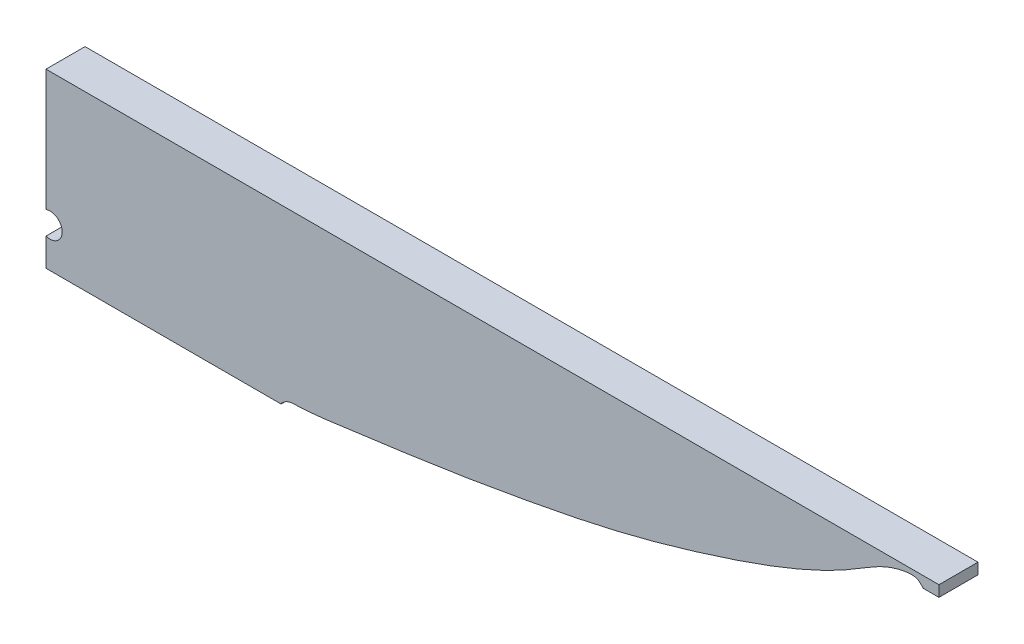
ISO-10303-21;
HEADER;
FILE_DESCRIPTION(('STEP AP214'),'2;1');
FILE_NAME('part.step','',(''),(''),'','','');
FILE_SCHEMA(('AUTOMOTIVE_DESIGN { 1 0 10303 214 1 1 1 1 }'));
ENDSEC;
DATA;
#1=APPLICATION_CONTEXT('core data for automotive mechanical design processes');
#2=APPLICATION_PROTOCOL_DEFINITION('international standard','automotive_design',2000,#1);
#3=PRODUCT_CONTEXT('',#1,'mechanical');
#4=PRODUCT('Part','Part','',(#3));
#5=PRODUCT_RELATED_PRODUCT_CATEGORY('part','',(#4));
#6=PRODUCT_DEFINITION_FORMATION('','',#4);
#7=PRODUCT_DEFINITION_CONTEXT('part definition',#1,'design');
#8=PRODUCT_DEFINITION('design','',#6,#7);
#9=PRODUCT_DEFINITION_SHAPE('','',#8);
#10=(LENGTH_UNIT() NAMED_UNIT(*) SI_UNIT(.MILLI.,.METRE.));
#11=(NAMED_UNIT(*) PLANE_ANGLE_UNIT() SI_UNIT($,.RADIAN.));
#12=(NAMED_UNIT(*) SI_UNIT($,.STERADIAN.) SOLID_ANGLE_UNIT());
#13=UNCERTAINTY_MEASURE_WITH_UNIT(LENGTH_MEASURE(1.E-05),#10,'distance_accuracy_value','');
#14=(GEOMETRIC_REPRESENTATION_CONTEXT(3) GLOBAL_UNCERTAINTY_ASSIGNED_CONTEXT((#13)) GLOBAL_UNIT_ASSIGNED_CONTEXT((#10,
#11,#12)) REPRESENTATION_CONTEXT('',''));
#15=CARTESIAN_POINT('',(0.,0.,0.));
#16=DIRECTION('',(0.,0.,1.));
#17=DIRECTION('',(1.,0.,0.));
#18=AXIS2_PLACEMENT_3D('',#15,#16,#17);
#19=CARTESIAN_POINT('',(-100.827016424963,-33.081913003255,332.));
#20=DIRECTION('',(1.,0.,0.));
#21=DIRECTION('',(0.,0.,-1.));
#22=AXIS2_PLACEMENT_3D('',#19,#20,#21);
#23=PLANE('',#22);
#24=DIRECTION('',(0.,-1.,0.));
#25=VECTOR('',#24,1.);
#26=CARTESIAN_POINT('',(-100.827016424963,-33.081913003255,324.));
#27=LINE('',#26,#25);
#28=CARTESIAN_POINT('',(-100.827016424963,2.25600000000002,324.));
#29=VERTEX_POINT('',#28);
#30=CARTESIAN_POINT('',(-100.827016424963,-22.6407535455487,324.));
#31=VERTEX_POINT('',#30);
#32=EDGE_CURVE('E188',#29,#31,#27,.T.);
#33=ORIENTED_EDGE('',*,*,#32,.T.);
#34=DIRECTION('',(0.,0.,1.));
#35=VECTOR('',#34,1.);
#36=CARTESIAN_POINT('',(-100.827016424963,-22.6407535455487,308.));
#37=LINE('',#36,#35);
#38=CARTESIAN_POINT('',(-100.827016424963,-22.6407535455487,332.));
#39=VERTEX_POINT('',#38);
#40=EDGE_CURVE('E46',#31,#39,#37,.T.);
#41=ORIENTED_EDGE('',*,*,#40,.T.);
#42=DIRECTION('',(0.,-1.,0.));
#43=VECTOR('',#42,1.);
#44=CARTESIAN_POINT('',(-100.827016424963,-33.081913003255,332.));
#45=LINE('',#44,#43);
#46=CARTESIAN_POINT('',(-100.827016424963,2.25600000000002,332.));
#47=VERTEX_POINT('',#46);
#48=EDGE_CURVE('E115',#47,#39,#45,.T.);
#49=ORIENTED_EDGE('',*,*,#48,.F.);
#50=DIRECTION('',(0.,0.,-1.));
#51=VECTOR('',#50,1.);
#52=CARTESIAN_POINT('',(-100.827016424963,2.25600000000002,332.));
#53=LINE('',#52,#51);
#54=EDGE_CURVE('E176',#47,#29,#53,.T.);
#55=ORIENTED_EDGE('',*,*,#54,.T.);
#56=EDGE_LOOP('',(#33,#41,#49,#55));
#57=FACE_BOUND('',#56,.T.);
#58=ADVANCED_FACE('F30',(#57),#23,.F.);
#59=CARTESIAN_POINT('',(82.1113920303362,2.25600000000005,332.));
#60=DIRECTION('',(-1.,0.,0.));
#61=DIRECTION('',(0.,0.,1.));
#62=AXIS2_PLACEMENT_3D('',#59,#60,#61);
#63=PLANE('',#62);
#64=DIRECTION('',(0.,1.,0.));
#65=VECTOR('',#64,1.);
#66=CARTESIAN_POINT('',(82.1113920303362,2.25600000000005,324.));
#67=LINE('',#66,#65);
#68=CARTESIAN_POINT('',(82.1113920303362,0.,324.));
#69=VERTEX_POINT('',#68);
#70=CARTESIAN_POINT('',(82.1113920303362,2.25600000000005,324.));
#71=VERTEX_POINT('',#70);
#72=EDGE_CURVE('E164',#69,#71,#67,.T.);
#73=ORIENTED_EDGE('',*,*,#72,.T.);
#74=DIRECTION('',(0.,0.,-1.));
#75=VECTOR('',#74,1.);
#76=CARTESIAN_POINT('',(82.1113920303362,2.25600000000005,332.));
#77=LINE('',#76,#75);
#78=CARTESIAN_POINT('',(82.1113920303362,2.25600000000005,332.));
#79=VERTEX_POINT('',#78);
#80=EDGE_CURVE('E40',#79,#71,#77,.T.);
#81=ORIENTED_EDGE('',*,*,#80,.F.);
#82=DIRECTION('',(0.,1.,0.));
#83=VECTOR('',#82,1.);
#84=CARTESIAN_POINT('',(82.1113920303362,2.25600000000005,332.));
#85=LINE('',#84,#83);
#86=CARTESIAN_POINT('',(82.1113920303362,0.,332.));
#87=VERTEX_POINT('',#86);
#88=EDGE_CURVE('E224',#87,#79,#85,.T.);
#89=ORIENTED_EDGE('',*,*,#88,.F.);
#90=DIRECTION('',(0.,0.,-1.));
#91=VECTOR('',#90,1.);
#92=CARTESIAN_POINT('',(82.1113920303362,0.,332.));
#93=LINE('',#92,#91);
#94=EDGE_CURVE('E174',#87,#69,#93,.T.);
#95=ORIENTED_EDGE('',*,*,#94,.T.);
#96=EDGE_LOOP('',(#73,#81,#89,#95));
#97=FACE_BOUND('',#96,.T.);
#98=ADVANCED_FACE('F32',(#97),#63,.F.);
#99=CARTESIAN_POINT('',(82.1113920303362,2.25600000000005,332.));
#100=DIRECTION('',(0.,-1.,0.));
#101=DIRECTION('',(1.,0.,0.));
#102=AXIS2_PLACEMENT_3D('',#99,#100,#101);
#103=PLANE('',#102);
#104=DIRECTION('',(-1.,0.,0.));
#105=VECTOR('',#104,1.);
#106=CARTESIAN_POINT('',(82.1113920303362,2.25600000000005,324.));
#107=LINE('',#106,#105);
#108=EDGE_CURVE('E170',#71,#29,#107,.T.);
#109=ORIENTED_EDGE('',*,*,#108,.T.);
#110=ORIENTED_EDGE('',*,*,#54,.F.);
#111=DIRECTION('',(-1.,0.,0.));
#112=VECTOR('',#111,1.);
#113=CARTESIAN_POINT('',(82.1113920303362,2.25600000000005,332.));
#114=LINE('',#113,#112);
#115=EDGE_CURVE('E91',#79,#47,#114,.T.);
#116=ORIENTED_EDGE('',*,*,#115,.F.);
#117=ORIENTED_EDGE('',*,*,#80,.T.);
#118=EDGE_LOOP('',(#109,#110,#116,#117));
#119=FACE_BOUND('',#118,.T.);
#120=ADVANCED_FACE('F180',(#119),#103,.F.);
#121=CARTESIAN_POINT('',(-100.827016424963,-27.3592464544513,332.));
#122=VERTEX_POINT('',#121);
#123=CARTESIAN_POINT('',(-100.827016424963,-33.081913003255,332.));
#124=VERTEX_POINT('',#123);
#125=EDGE_CURVE('E34',#122,#124,#45,.T.);
#126=ORIENTED_EDGE('',*,*,#125,.F.);
#127=DIRECTION('',(0.,0.,1.));
#128=VECTOR('',#127,1.);
#129=CARTESIAN_POINT('',(-100.827016424963,-27.3592464544513,308.));
#130=LINE('',#129,#128);
#131=CARTESIAN_POINT('',(-100.827016424963,-27.3592464544513,324.));
#132=VERTEX_POINT('',#131);
#133=EDGE_CURVE('E259',#122,#132,#130,.F.);
#134=ORIENTED_EDGE('',*,*,#133,.T.);
#135=CARTESIAN_POINT('',(-100.827016424963,-33.081913003255,324.));
#136=VERTEX_POINT('',#135);
#137=EDGE_CURVE('E173',#132,#136,#27,.T.);
#138=ORIENTED_EDGE('',*,*,#137,.T.);
#139=DIRECTION('',(0.,0.,-1.));
#140=VECTOR('',#139,1.);
#141=CARTESIAN_POINT('',(-100.827016424963,-33.081913003255,332.));
#142=LINE('',#141,#140);
#143=EDGE_CURVE('E126',#124,#136,#142,.T.);
#144=ORIENTED_EDGE('',*,*,#143,.F.);
#145=EDGE_LOOP('',(#126,#134,#138,#144));
#146=FACE_BOUND('',#145,.T.);
#147=ADVANCED_FACE('F257',(#146),#23,.F.);
#148=CARTESIAN_POINT('',(-100.827016424963,-33.081913003255,332.));
#149=CARTESIAN_POINT('',(-84.774613711413,-33.0815951122996,332.));
#150=CARTESIAN_POINT('',(-68.7222110004775,-33.0811561721189,332.));
#151=CARTESIAN_POINT('',(-52.6698082887919,-33.080755029534,332.));
#152=B_SPLINE_CURVE_WITH_KNOTS('',3,(#148,#149,#150,#151),.UNSPECIFIED.,.F.,.F.,(4,4),(0.,1.),.UNSPECIFIED.);
#153=DIRECTION('',(0.,0.,-1.));
#154=VECTOR('',#153,1.);
#155=SURFACE_OF_LINEAR_EXTRUSION('',#152,#154);
#156=CARTESIAN_POINT('',(-100.827016424963,-33.081913003255,324.));
#157=CARTESIAN_POINT('',(-84.774613711413,-33.0815951122996,324.));
#158=CARTESIAN_POINT('',(-68.7222110004775,-33.0811561721189,324.));
#159=CARTESIAN_POINT('',(-52.6698082887919,-33.080755029534,324.));
#160=B_SPLINE_CURVE_WITH_KNOTS('',3,(#156,#157,#158,#159),.UNSPECIFIED.,.F.,.F.,(4,4),(0.,1.),.UNSPECIFIED.);
#161=CARTESIAN_POINT('',(-52.6698082887919,-33.080755029534,324.));
#162=VERTEX_POINT('',#161);
#163=EDGE_CURVE('E122',#136,#162,#160,.T.);
#164=ORIENTED_EDGE('',*,*,#163,.T.);
#165=DIRECTION('',(0.,0.,-1.));
#166=VECTOR('',#165,1.);
#167=CARTESIAN_POINT('',(-52.6698082887919,-33.080755029534,332.));
#168=LINE('',#167,#166);
#169=CARTESIAN_POINT('',(-52.6698082887919,-33.080755029534,332.));
#170=VERTEX_POINT('',#169);
#171=EDGE_CURVE('E119',#170,#162,#168,.T.);
#172=ORIENTED_EDGE('',*,*,#171,.F.);
#173=CARTESIAN_POINT('',(-52.6698082887919,-33.080755029534,332.));
#174=CARTESIAN_POINT('',(-68.7222110004775,-33.0811561721189,332.));
#175=CARTESIAN_POINT('',(-84.774613711413,-33.0815951122996,332.));
#176=CARTESIAN_POINT('',(-100.827016424963,-33.081913003255,332.));
#177=B_SPLINE_CURVE_WITH_KNOTS('',3,(#173,#174,#175,#176),.UNSPECIFIED.,.F.,.F.,(4,4),(0.,1.),.UNSPECIFIED.);
#178=EDGE_CURVE('E100',#124,#170,#177,.F.);
#179=ORIENTED_EDGE('',*,*,#178,.F.);
#180=ORIENTED_EDGE('',*,*,#143,.T.);
#181=EDGE_LOOP('',(#164,#172,#179,#180));
#182=FACE_BOUND('',#181,.T.);
#183=ADVANCED_FACE('F120',(#182),#155,.F.);
#184=CARTESIAN_POINT('',(-52.6698082887919,-33.0807550295342,332.));
#185=CARTESIAN_POINT('',(-52.6459288193923,-32.993859613546,332.));
#186=CARTESIAN_POINT('',(-52.5964445249016,-32.9160010838951,332.));
#187=CARTESIAN_POINT('',(-52.4788610075601,-32.7802116073325,332.));
#188=CARTESIAN_POINT('',(-52.4120538413609,-32.7189606582056,332.));
#189=CARTESIAN_POINT('',(-52.2093217650453,-32.5420641836748,332.));
#190=CARTESIAN_POINT('',(-52.0713318989255,-32.4280088488657,332.));
#191=CARTESIAN_POINT('',(-51.7790689327255,-32.2221573606945,332.));
#192=CARTESIAN_POINT('',(-51.623777621292,-32.1288038338935,332.));
#193=CARTESIAN_POINT('',(-51.295199925624,-31.9806524852751,332.));
#194=CARTESIAN_POINT('',(-51.1257173013087,-31.9246281451941,332.));
#195=CARTESIAN_POINT('',(-50.6068560542936,-31.7927475364728,332.));
#196=CARTESIAN_POINT('',(-50.2469597365105,-31.751276654125,332.));
#197=CARTESIAN_POINT('',(-49.5317829099257,-31.6981341170204,332.));
#198=CARTESIAN_POINT('',(-49.173271936455,-31.689012229282,332.));
#199=CARTESIAN_POINT('',(-48.4560217750204,-31.675084921922,332.));
#200=CARTESIAN_POINT('',(-48.0973783514509,-31.6677016897092,332.));
#201=CARTESIAN_POINT('',(-47.3813550939062,-31.6366085746147,332.));
#202=CARTESIAN_POINT('',(-47.0237970705175,-31.6152622759568,332.));
#203=CARTESIAN_POINT('',(-45.9523884822612,-31.5350430882046,332.));
#204=CARTESIAN_POINT('',(-45.2398338600723,-31.458986708406,332.));
#205=CARTESIAN_POINT('',(-43.8164770205454,-31.2870293195402,332.));
#206=CARTESIAN_POINT('',(-43.1057742432853,-31.1935671478601,332.));
#207=CARTESIAN_POINT('',(-41.6840392919182,-31.0091693793472,332.));
#208=CARTESIAN_POINT('',(-40.973275595805,-30.916174473955,332.));
#209=CARTESIAN_POINT('',(-38.8413844192581,-30.6341223116694,332.));
#210=CARTESIAN_POINT('',(-37.4206530113154,-30.442019269969,332.));
#211=CARTESIAN_POINT('',(-30.3174701192713,-29.4782284037623,332.));
#212=CARTESIAN_POINT('',(-24.6358674131537,-28.6982498607601,332.));
#213=CARTESIAN_POINT('',(-16.1325292267238,-27.4004861615708,332.));
#214=CARTESIAN_POINT('',(-13.3015486273591,-26.9452876655893,332.));
#215=CARTESIAN_POINT('',(-7.64822428606581,-25.9871284467109,332.));
#216=CARTESIAN_POINT('',(-4.82548491673351,-25.4854674651628,332.));
#217=CARTESIAN_POINT('',(0.813373664340472,-24.4440369592175,332.));
#218=CARTESIAN_POINT('',(3.62992634891086,-23.906445413428,332.));
#219=CARTESIAN_POINT('',(9.24962282727236,-22.7705019877499,332.));
#220=CARTESIAN_POINT('',(12.0529053357947,-22.171640533217,332.));
#221=CARTESIAN_POINT('',(17.6382852993076,-20.8742484684365,332.));
#222=CARTESIAN_POINT('',(20.4200178670315,-20.1741115562766,332.));
#223=CARTESIAN_POINT('',(25.9546207324782,-18.6792712353022,332.));
#224=CARTESIAN_POINT('',(28.7088847905541,-17.8854180581698,332.));
#225=CARTESIAN_POINT('',(34.1982685388061,-16.2295284402204,332.));
#226=CARTESIAN_POINT('',(36.9329287008495,-15.3653492232889,332.));
#227=CARTESIAN_POINT('',(42.3734694388545,-13.5530699157961,332.));
#228=CARTESIAN_POINT('',(45.0810462763568,-12.6071646188962,332.));
#229=CARTESIAN_POINT('',(49.104262429535,-11.0884032864293,332.));
#230=CARTESIAN_POINT('',(50.4396314793815,-10.5648472890822,332.));
#231=CARTESIAN_POINT('',(53.0907078040388,-9.47468387068912,332.));
#232=CARTESIAN_POINT('',(54.4053494139336,-8.90777741064122,332.));
#233=CARTESIAN_POINT('',(57.0132470299496,-7.73113117450325,332.));
#234=CARTESIAN_POINT('',(58.3067678449875,-7.12192178531004,332.));
#235=CARTESIAN_POINT('',(60.8657812324962,-5.84736512161154,332.));
#236=CARTESIAN_POINT('',(62.1309233306964,-5.18131588071075,332.));
#237=CARTESIAN_POINT('',(63.9962601275164,-4.11739529035936,332.));
#238=CARTESIAN_POINT('',(64.6128439227312,-3.75234973163825,332.));
#239=CARTESIAN_POINT('',(65.8406257211151,-3.01147138858089,332.));
#240=CARTESIAN_POINT('',(66.450997718048,-2.63393586569267,332.));
#241=CARTESIAN_POINT('',(68.2876353823161,-1.51273540880524,332.));
#242=CARTESIAN_POINT('',(69.5206165603154,-0.783203949088886,332.));
#243=CARTESIAN_POINT('',(71.4736784621574,0.0939442003787461,332.));
#244=CARTESIAN_POINT('',(72.1426300150132,0.348739536224795,332.));
#245=CARTESIAN_POINT('',(73.5170350650628,0.781813634335334,332.));
#246=CARTESIAN_POINT('',(74.222533778346,0.961977538938361,332.));
#247=CARTESIAN_POINT('',(75.2868574589146,1.15175657994603,332.));
#248=CARTESIAN_POINT('',(75.6435851492788,1.20221348150741,332.));
#249=CARTESIAN_POINT('',(76.1847595378769,1.23802569945772,332.));
#250=CARTESIAN_POINT('',(76.3661243033787,1.24358310144205,332.));
#251=CARTESIAN_POINT('',(76.7312343780699,1.23909342876428,332.));
#252=CARTESIAN_POINT('',(76.9134088845982,1.22829822744566,332.));
#253=CARTESIAN_POINT('',(77.272464657852,1.17600235274354,332.));
#254=CARTESIAN_POINT('',(77.4524903499698,1.13299986002375,332.));
#255=CARTESIAN_POINT('',(77.7899191477673,0.994787679784837,332.));
#256=CARTESIAN_POINT('',(77.9427219070534,0.896941907088373,332.));
#257=CARTESIAN_POINT('',(78.2315091005825,0.670873019386202,332.));
#258=CARTESIAN_POINT('',(78.363654407321,0.544381302364877,332.));
#259=CARTESIAN_POINT('',(78.567692004139,0.361047450827228,332.));
#260=CARTESIAN_POINT('',(78.6359377953498,0.300191779050567,332.));
#261=CARTESIAN_POINT('',(78.7600859233667,0.164954111718898,332.));
#262=CARTESIAN_POINT('',(78.8129308941601,0.0885267114553283,332.));
#263=CARTESIAN_POINT('',(78.8395911647111,0.,332.));
#264=B_SPLINE_CURVE_WITH_KNOTS('',3,(#184,#185,#186,#187,#188,#189,#190,#191,#192,#193,#194,
#195,#196,#197,#198,#199,#200,#201,#202,#203,#204,#205,#206,#207,#208,#209,#210,#211,#212,#213,
#214,#215,#216,#217,#218,#219,#220,#221,#222,#223,#224,#225,#226,#227,#228,#229,#230,#231,#232,
#233,#234,#235,#236,#237,#238,#239,#240,#241,#242,#243,#244,#245,#246,#247,#248,#249,#250,#251,
#252,#253,#254,#255,#256,#257,#258,#259,#260,#261,#262,#263),.UNSPECIFIED.,.F.,.F.,(4,2,2,2,2,2,
2,2,2,2,2,2,2,2,2,2,2,2,2,2,2,2,2,2,2,2,2,2,2,2,2,2,2,2,2,2,2,2,2,4),(0.,0.00195312499999989,
0.00390624999999978,0.00781249999999978,0.0117187499999998,0.0156249999999997,
0.0234374999999997,0.0312499999999997,0.0390624999999997,0.0468749999999996,0.0624999999999996,
0.0781249999999994,0.0937499999999994,0.124999999999999,0.249999999999999,0.312499999999999,
0.374999999999999,0.437499999999999,0.499999999999999,0.562499999999999,0.624999999999999,
0.687499999999999,0.749999999999999,0.781249999999999,0.812499999999999,0.843749999999999,
0.874999999999999,0.890624999999999,0.906249999999999,0.937499999999999,0.953124999999998,
0.968749999999998,0.976562499999999,0.980468749999999,0.984374999999999,0.988281249999999,
0.992187499999999,0.99609375,0.998046875,1.),.UNSPECIFIED.);
#265=DIRECTION('',(0.,0.,-1.));
#266=VECTOR('',#265,1.);
#267=SURFACE_OF_LINEAR_EXTRUSION('',#264,#266);
#268=CARTESIAN_POINT('',(-52.6698082887919,-33.0807550295342,324.));
#269=CARTESIAN_POINT('',(-52.6459288193923,-32.993859613546,324.));
#270=CARTESIAN_POINT('',(-52.5964445249016,-32.9160010838951,324.));
#271=CARTESIAN_POINT('',(-52.4788610075601,-32.7802116073325,324.));
#272=CARTESIAN_POINT('',(-52.4120538413609,-32.7189606582056,324.));
#273=CARTESIAN_POINT('',(-52.2093217650453,-32.5420641836748,324.));
#274=CARTESIAN_POINT('',(-52.0713318989255,-32.4280088488657,324.));
#275=CARTESIAN_POINT('',(-51.7790689327255,-32.2221573606945,324.));
#276=CARTESIAN_POINT('',(-51.623777621292,-32.1288038338935,324.));
#277=CARTESIAN_POINT('',(-51.295199925624,-31.9806524852751,324.));
#278=CARTESIAN_POINT('',(-51.1257173013087,-31.9246281451941,324.));
#279=CARTESIAN_POINT('',(-50.6068560542936,-31.7927475364728,324.));
#280=CARTESIAN_POINT('',(-50.2469597365105,-31.751276654125,324.));
#281=CARTESIAN_POINT('',(-49.5317829099257,-31.6981341170204,324.));
#282=CARTESIAN_POINT('',(-49.173271936455,-31.689012229282,324.));
#283=CARTESIAN_POINT('',(-48.4560217750204,-31.675084921922,324.));
#284=CARTESIAN_POINT('',(-48.0973783514509,-31.6677016897092,324.));
#285=CARTESIAN_POINT('',(-47.3813550939062,-31.6366085746147,324.));
#286=CARTESIAN_POINT('',(-47.0237970705175,-31.6152622759568,324.));
#287=CARTESIAN_POINT('',(-45.9523884822612,-31.5350430882046,324.));
#288=CARTESIAN_POINT('',(-45.2398338600723,-31.458986708406,324.));
#289=CARTESIAN_POINT('',(-43.8164770205454,-31.2870293195402,324.));
#290=CARTESIAN_POINT('',(-43.1057742432853,-31.1935671478601,324.));
#291=CARTESIAN_POINT('',(-41.6840392919182,-31.0091693793472,324.));
#292=CARTESIAN_POINT('',(-40.973275595805,-30.916174473955,324.));
#293=CARTESIAN_POINT('',(-38.8413844192581,-30.6341223116694,324.));
#294=CARTESIAN_POINT('',(-37.4206530113154,-30.442019269969,324.));
#295=CARTESIAN_POINT('',(-30.3174701192713,-29.4782284037623,324.));
#296=CARTESIAN_POINT('',(-24.6358674131537,-28.6982498607601,324.));
#297=CARTESIAN_POINT('',(-16.1325292267238,-27.4004861615708,324.));
#298=CARTESIAN_POINT('',(-13.3015486273591,-26.9452876655893,324.));
#299=CARTESIAN_POINT('',(-7.64822428606581,-25.9871284467109,324.));
#300=CARTESIAN_POINT('',(-4.82548491673351,-25.4854674651628,324.));
#301=CARTESIAN_POINT('',(0.813373664340472,-24.4440369592175,324.));
#302=CARTESIAN_POINT('',(3.62992634891086,-23.906445413428,324.));
#303=CARTESIAN_POINT('',(9.24962282727236,-22.7705019877499,324.));
#304=CARTESIAN_POINT('',(12.0529053357947,-22.171640533217,324.));
#305=CARTESIAN_POINT('',(17.6382852993076,-20.8742484684365,324.));
#306=CARTESIAN_POINT('',(20.4200178670315,-20.1741115562766,324.));
#307=CARTESIAN_POINT('',(25.9546207324782,-18.6792712353022,324.));
#308=CARTESIAN_POINT('',(28.7088847905541,-17.8854180581698,324.));
#309=CARTESIAN_POINT('',(34.1982685388061,-16.2295284402204,324.));
#310=CARTESIAN_POINT('',(36.9329287008495,-15.3653492232889,324.));
#311=CARTESIAN_POINT('',(42.3734694388545,-13.5530699157961,324.));
#312=CARTESIAN_POINT('',(45.0810462763568,-12.6071646188962,324.));
#313=CARTESIAN_POINT('',(49.104262429535,-11.0884032864293,324.));
#314=CARTESIAN_POINT('',(50.4396314793815,-10.5648472890822,324.));
#315=CARTESIAN_POINT('',(53.0907078040388,-9.47468387068912,324.));
#316=CARTESIAN_POINT('',(54.4053494139336,-8.90777741064122,324.));
#317=CARTESIAN_POINT('',(57.0132470299496,-7.73113117450325,324.));
#318=CARTESIAN_POINT('',(58.3067678449875,-7.12192178531004,324.));
#319=CARTESIAN_POINT('',(60.8657812324962,-5.84736512161154,324.));
#320=CARTESIAN_POINT('',(62.1309233306964,-5.18131588071075,324.));
#321=CARTESIAN_POINT('',(63.9962601275164,-4.11739529035936,324.));
#322=CARTESIAN_POINT('',(64.6128439227312,-3.75234973163825,324.));
#323=CARTESIAN_POINT('',(65.8406257211151,-3.01147138858089,324.));
#324=CARTESIAN_POINT('',(66.450997718048,-2.63393586569267,324.));
#325=CARTESIAN_POINT('',(68.2876353823161,-1.51273540880524,324.));
#326=CARTESIAN_POINT('',(69.5206165603154,-0.783203949088886,324.));
#327=CARTESIAN_POINT('',(71.4736784621574,0.0939442003787461,324.));
#328=CARTESIAN_POINT('',(72.1426300150132,0.348739536224795,324.));
#329=CARTESIAN_POINT('',(73.5170350650628,0.781813634335334,324.));
#330=CARTESIAN_POINT('',(74.222533778346,0.961977538938361,324.));
#331=CARTESIAN_POINT('',(75.2868574589146,1.15175657994603,324.));
#332=CARTESIAN_POINT('',(75.6435851492788,1.20221348150741,324.));
#333=CARTESIAN_POINT('',(76.1847595378769,1.23802569945772,324.));
#334=CARTESIAN_POINT('',(76.3661243033787,1.24358310144205,324.));
#335=CARTESIAN_POINT('',(76.7312343780699,1.23909342876428,324.));
#336=CARTESIAN_POINT('',(76.9134088845982,1.22829822744566,324.));
#337=CARTESIAN_POINT('',(77.272464657852,1.17600235274354,324.));
#338=CARTESIAN_POINT('',(77.4524903499698,1.13299986002375,324.));
#339=CARTESIAN_POINT('',(77.7899191477673,0.994787679784837,324.));
#340=CARTESIAN_POINT('',(77.9427219070534,0.896941907088373,324.));
#341=CARTESIAN_POINT('',(78.2315091005825,0.670873019386202,324.));
#342=CARTESIAN_POINT('',(78.363654407321,0.544381302364877,324.));
#343=CARTESIAN_POINT('',(78.567692004139,0.361047450827228,324.));
#344=CARTESIAN_POINT('',(78.6359377953498,0.300191779050567,324.));
#345=CARTESIAN_POINT('',(78.7600859233667,0.164954111718898,324.));
#346=CARTESIAN_POINT('',(78.8129308941601,0.0885267114553283,324.));
#347=CARTESIAN_POINT('',(78.8395911647111,0.,324.));
#348=B_SPLINE_CURVE_WITH_KNOTS('',3,(#268,#269,#270,#271,#272,#273,#274,#275,#276,#277,#278,
#279,#280,#281,#282,#283,#284,#285,#286,#287,#288,#289,#290,#291,#292,#293,#294,#295,#296,#297,
#298,#299,#300,#301,#302,#303,#304,#305,#306,#307,#308,#309,#310,#311,#312,#313,#314,#315,#316,
#317,#318,#319,#320,#321,#322,#323,#324,#325,#326,#327,#328,#329,#330,#331,#332,#333,#334,#335,
#336,#337,#338,#339,#340,#341,#342,#343,#344,#345,#346,#347),.UNSPECIFIED.,.F.,.F.,(4,2,2,2,2,2,
2,2,2,2,2,2,2,2,2,2,2,2,2,2,2,2,2,2,2,2,2,2,2,2,2,2,2,2,2,2,2,2,2,4),(0.,0.00195312499999989,
0.00390624999999978,0.00781249999999978,0.0117187499999998,0.0156249999999997,
0.0234374999999997,0.0312499999999997,0.0390624999999997,0.0468749999999996,0.0624999999999996,
0.0781249999999994,0.0937499999999994,0.124999999999999,0.249999999999999,0.312499999999999,
0.374999999999999,0.437499999999999,0.499999999999999,0.562499999999999,0.624999999999999,
0.687499999999999,0.749999999999999,0.781249999999999,0.812499999999999,0.843749999999999,
0.874999999999999,0.890624999999999,0.906249999999999,0.937499999999999,0.953124999999998,
0.968749999999998,0.976562499999999,0.980468749999999,0.984374999999999,0.988281249999999,
0.992187499999999,0.99609375,0.998046875,1.),.UNSPECIFIED.);
#349=CARTESIAN_POINT('',(78.8395911647111,0.,324.));
#350=VERTEX_POINT('',#349);
#351=EDGE_CURVE('E192',#162,#350,#348,.T.);
#352=ORIENTED_EDGE('',*,*,#351,.T.);
#353=DIRECTION('',(0.,0.,-1.));
#354=VECTOR('',#353,1.);
#355=CARTESIAN_POINT('',(78.8395911647111,0.,332.));
#356=LINE('',#355,#354);
#357=CARTESIAN_POINT('',(78.8395911647111,0.,332.));
#358=VERTEX_POINT('',#357);
#359=EDGE_CURVE('E127',#358,#350,#356,.T.);
#360=ORIENTED_EDGE('',*,*,#359,.F.);
#361=CARTESIAN_POINT('',(78.8395911647111,0.,332.));
#362=CARTESIAN_POINT('',(78.8129308941601,0.0885267114553283,332.));
#363=CARTESIAN_POINT('',(78.7600859233667,0.164954111718898,332.));
#364=CARTESIAN_POINT('',(78.6359377953498,0.300191779050567,332.));
#365=CARTESIAN_POINT('',(78.567692004139,0.361047450827228,332.));
#366=CARTESIAN_POINT('',(78.363654407321,0.544381302364877,332.));
#367=CARTESIAN_POINT('',(78.2315091005825,0.670873019386202,332.));
#368=CARTESIAN_POINT('',(77.9427219070534,0.896941907088373,332.));
#369=CARTESIAN_POINT('',(77.7899191477673,0.994787679784837,332.));
#370=CARTESIAN_POINT('',(77.4524903499698,1.13299986002375,332.));
#371=CARTESIAN_POINT('',(77.272464657852,1.17600235274354,332.));
#372=CARTESIAN_POINT('',(76.9134088845982,1.22829822744566,332.));
#373=CARTESIAN_POINT('',(76.7312343780699,1.23909342876428,332.));
#374=CARTESIAN_POINT('',(76.3661243033787,1.24358310144205,332.));
#375=CARTESIAN_POINT('',(76.1847595378769,1.23802569945772,332.));
#376=CARTESIAN_POINT('',(75.6435851492788,1.20221348150741,332.));
#377=CARTESIAN_POINT('',(75.2868574589146,1.15175657994603,332.));
#378=CARTESIAN_POINT('',(74.222533778346,0.961977538938361,332.));
#379=CARTESIAN_POINT('',(73.5170350650628,0.781813634335334,332.));
#380=CARTESIAN_POINT('',(72.1426300150132,0.348739536224795,332.));
#381=CARTESIAN_POINT('',(71.4736784621574,0.0939442003787461,332.));
#382=CARTESIAN_POINT('',(69.5206165603154,-0.783203949088886,332.));
#383=CARTESIAN_POINT('',(68.2876353823161,-1.51273540880524,332.));
#384=CARTESIAN_POINT('',(66.450997718048,-2.63393586569267,332.));
#385=CARTESIAN_POINT('',(65.8406257211151,-3.01147138858089,332.));
#386=CARTESIAN_POINT('',(64.6128439227312,-3.75234973163825,332.));
#387=CARTESIAN_POINT('',(63.9962601275164,-4.11739529035936,332.));
#388=CARTESIAN_POINT('',(62.1309233306964,-5.18131588071075,332.));
#389=CARTESIAN_POINT('',(60.8657812324962,-5.84736512161154,332.));
#390=CARTESIAN_POINT('',(58.3067678449875,-7.12192178531004,332.));
#391=CARTESIAN_POINT('',(57.0132470299496,-7.73113117450325,332.));
#392=CARTESIAN_POINT('',(54.4053494139336,-8.90777741064122,332.));
#393=CARTESIAN_POINT('',(53.0907078040388,-9.47468387068912,332.));
#394=CARTESIAN_POINT('',(50.4396314793815,-10.5648472890822,332.));
#395=CARTESIAN_POINT('',(49.104262429535,-11.0884032864293,332.));
#396=CARTESIAN_POINT('',(45.0810462763568,-12.6071646188962,332.));
#397=CARTESIAN_POINT('',(42.3734694388545,-13.5530699157961,332.));
#398=CARTESIAN_POINT('',(36.9329287008495,-15.3653492232889,332.));
#399=CARTESIAN_POINT('',(34.1982685388061,-16.2295284402204,332.));
#400=CARTESIAN_POINT('',(28.7088847905541,-17.8854180581698,332.));
#401=CARTESIAN_POINT('',(25.9546207324782,-18.6792712353022,332.));
#402=CARTESIAN_POINT('',(20.4200178670315,-20.1741115562766,332.));
#403=CARTESIAN_POINT('',(17.6382852993076,-20.8742484684365,332.));
#404=CARTESIAN_POINT('',(12.0529053357947,-22.171640533217,332.));
#405=CARTESIAN_POINT('',(9.24962282727236,-22.7705019877499,332.));
#406=CARTESIAN_POINT('',(3.62992634891086,-23.906445413428,332.));
#407=CARTESIAN_POINT('',(0.813373664340472,-24.4440369592175,332.));
#408=CARTESIAN_POINT('',(-4.82548491673351,-25.4854674651628,332.));
#409=CARTESIAN_POINT('',(-7.64822428606581,-25.9871284467109,332.));
#410=CARTESIAN_POINT('',(-13.3015486273591,-26.9452876655893,332.));
#411=CARTESIAN_POINT('',(-16.1325292267238,-27.4004861615708,332.));
#412=CARTESIAN_POINT('',(-24.6358674131537,-28.6982498607601,332.));
#413=CARTESIAN_POINT('',(-30.3174701192713,-29.4782284037623,332.));
#414=CARTESIAN_POINT('',(-37.4206530113154,-30.442019269969,332.));
#415=CARTESIAN_POINT('',(-38.8413844192581,-30.6341223116694,332.));
#416=CARTESIAN_POINT('',(-40.973275595805,-30.916174473955,332.));
#417=CARTESIAN_POINT('',(-41.6840392919182,-31.0091693793472,332.));
#418=CARTESIAN_POINT('',(-43.1057742432853,-31.1935671478601,332.));
#419=CARTESIAN_POINT('',(-43.8164770205454,-31.2870293195402,332.));
#420=CARTESIAN_POINT('',(-45.2398338600723,-31.458986708406,332.));
#421=CARTESIAN_POINT('',(-45.9523884822612,-31.5350430882046,332.));
#422=CARTESIAN_POINT('',(-47.0237970705175,-31.6152622759568,332.));
#423=CARTESIAN_POINT('',(-47.3813550939062,-31.6366085746147,332.));
#424=CARTESIAN_POINT('',(-48.0973783514509,-31.6677016897092,332.));
#425=CARTESIAN_POINT('',(-48.4560217750204,-31.675084921922,332.));
#426=CARTESIAN_POINT('',(-49.173271936455,-31.689012229282,332.));
#427=CARTESIAN_POINT('',(-49.5317829099257,-31.6981341170204,332.));
#428=CARTESIAN_POINT('',(-50.2469597365105,-31.751276654125,332.));
#429=CARTESIAN_POINT('',(-50.6068560542936,-31.7927475364728,332.));
#430=CARTESIAN_POINT('',(-51.1257173013087,-31.9246281451941,332.));
#431=CARTESIAN_POINT('',(-51.295199925624,-31.9806524852751,332.));
#432=CARTESIAN_POINT('',(-51.623777621292,-32.1288038338935,332.));
#433=CARTESIAN_POINT('',(-51.7790689327255,-32.2221573606945,332.));
#434=CARTESIAN_POINT('',(-52.0713318989255,-32.4280088488657,332.));
#435=CARTESIAN_POINT('',(-52.2093217650453,-32.5420641836748,332.));
#436=CARTESIAN_POINT('',(-52.4120538413609,-32.7189606582056,332.));
#437=CARTESIAN_POINT('',(-52.4788610075601,-32.7802116073325,332.));
#438=CARTESIAN_POINT('',(-52.5964445249016,-32.9160010838951,332.));
#439=CARTESIAN_POINT('',(-52.6459288193923,-32.993859613546,332.));
#440=CARTESIAN_POINT('',(-52.6698082887919,-33.0807550295342,332.));
#441=B_SPLINE_CURVE_WITH_KNOTS('',3,(#361,#362,#363,#364,#365,#366,#367,#368,#369,#370,#371,
#372,#373,#374,#375,#376,#377,#378,#379,#380,#381,#382,#383,#384,#385,#386,#387,#388,#389,#390,
#391,#392,#393,#394,#395,#396,#397,#398,#399,#400,#401,#402,#403,#404,#405,#406,#407,#408,#409,
#410,#411,#412,#413,#414,#415,#416,#417,#418,#419,#420,#421,#422,#423,#424,#425,#426,#427,#428,
#429,#430,#431,#432,#433,#434,#435,#436,#437,#438,#439,#440),.UNSPECIFIED.,.F.,.F.,(4,2,2,2,2,2,
2,2,2,2,2,2,2,2,2,2,2,2,2,2,2,2,2,2,2,2,2,2,2,2,2,2,2,2,2,2,2,2,2,4),(0.,0.00195312500000022,
0.00390625000000044,0.00781250000000067,0.0117187500000009,0.015625000000001,0.0195312500000012,
0.0234375000000014,0.0312500000000016,0.0468750000000016,0.0625000000000014,0.0937500000000013,
0.109375000000001,0.125000000000001,0.156250000000001,0.187500000000001,0.218750000000001,
0.250000000000001,0.312500000000001,0.375000000000001,0.437500000000001,0.500000000000001,
0.562500000000001,0.625000000000001,0.687500000000001,0.750000000000001,0.875000000000001,
0.906250000000001,0.921875000000001,0.9375,0.953125,0.9609375,0.96875,0.9765625,0.984375,
0.98828125,0.9921875,0.99609375,0.998046875,1.),.UNSPECIFIED.);
#442=EDGE_CURVE('E106',#170,#358,#441,.F.);
#443=ORIENTED_EDGE('',*,*,#442,.F.);
#444=ORIENTED_EDGE('',*,*,#171,.T.);
#445=EDGE_LOOP('',(#352,#360,#443,#444));
#446=FACE_BOUND('',#445,.T.);
#447=ADVANCED_FACE('F130',(#446),#267,.F.);
#448=CARTESIAN_POINT('',(78.8395911647111,0.,332.));
#449=DIRECTION('',(0.,1.,0.));
#450=DIRECTION('',(-1.,0.,0.));
#451=AXIS2_PLACEMENT_3D('',#448,#449,#450);
#452=PLANE('',#451);
#453=DIRECTION('',(1.,0.,0.));
#454=VECTOR('',#453,1.);
#455=CARTESIAN_POINT('',(78.8395911647111,0.,324.));
#456=LINE('',#455,#454);
#457=EDGE_CURVE('E82',#350,#69,#456,.T.);
#458=ORIENTED_EDGE('',*,*,#457,.T.);
#459=ORIENTED_EDGE('',*,*,#94,.F.);
#460=DIRECTION('',(1.,0.,0.));
#461=VECTOR('',#460,1.);
#462=CARTESIAN_POINT('',(78.8395911647111,0.,332.));
#463=LINE('',#462,#461);
#464=EDGE_CURVE('E55',#358,#87,#463,.T.);
#465=ORIENTED_EDGE('',*,*,#464,.F.);
#466=ORIENTED_EDGE('',*,*,#359,.T.);
#467=EDGE_LOOP('',(#458,#459,#465,#466));
#468=FACE_BOUND('',#467,.T.);
#469=ADVANCED_FACE('F150',(#468),#452,.F.);
#470=CARTESIAN_POINT('',(14.8455953175512,-21.5229445008267,332.));
#471=DIRECTION('',(0.,0.,-1.));
#472=DIRECTION('',(-1.,0.,0.));
#473=AXIS2_PLACEMENT_3D('',#470,#471,#472);
#474=PLANE('',#473);
#475=ORIENTED_EDGE('',*,*,#48,.T.);
#476=CARTESIAN_POINT('',(-100.,-25.,332.));
#477=DIRECTION('',(0.,0.,-1.));
#478=DIRECTION('',(-1.,0.,0.));
#479=AXIS2_PLACEMENT_3D('',#476,#477,#478);
#480=CIRCLE('',#479,2.5);
#481=EDGE_CURVE('E171',#39,#122,#480,.T.);
#482=ORIENTED_EDGE('',*,*,#481,.T.);
#483=ORIENTED_EDGE('',*,*,#125,.T.);
#484=ORIENTED_EDGE('',*,*,#178,.T.);
#485=ORIENTED_EDGE('',*,*,#442,.T.);
#486=ORIENTED_EDGE('',*,*,#464,.T.);
#487=ORIENTED_EDGE('',*,*,#88,.T.);
#488=ORIENTED_EDGE('',*,*,#115,.T.);
#489=EDGE_LOOP('',(#475,#482,#483,#484,#485,#486,#487,#488));
#490=FACE_BOUND('',#489,.T.);
#491=ADVANCED_FACE('F104',(#490),#474,.F.);
#492=CARTESIAN_POINT('',(14.8455953175512,-21.5229445008267,324.));
#493=DIRECTION('',(0.,0.,-1.));
#494=DIRECTION('',(-1.,0.,0.));
#495=AXIS2_PLACEMENT_3D('',#492,#493,#494);
#496=PLANE('',#495);
#497=CARTESIAN_POINT('',(-100.,-25.,324.));
#498=DIRECTION('',(0.,0.,-1.));
#499=DIRECTION('',(-1.,0.,0.));
#500=AXIS2_PLACEMENT_3D('',#497,#498,#499);
#501=CIRCLE('',#500,2.5);
#502=EDGE_CURVE('E11',#31,#132,#501,.T.);
#503=ORIENTED_EDGE('',*,*,#502,.F.);
#504=ORIENTED_EDGE('',*,*,#32,.F.);
#505=ORIENTED_EDGE('',*,*,#108,.F.);
#506=ORIENTED_EDGE('',*,*,#72,.F.);
#507=ORIENTED_EDGE('',*,*,#457,.F.);
#508=ORIENTED_EDGE('',*,*,#351,.F.);
#509=ORIENTED_EDGE('',*,*,#163,.F.);
#510=ORIENTED_EDGE('',*,*,#137,.F.);
#511=EDGE_LOOP('',(#503,#504,#505,#506,#507,#508,#509,#510));
#512=FACE_BOUND('',#511,.T.);
#513=ADVANCED_FACE('F185',(#512),#496,.T.);
#514=CARTESIAN_POINT('',(-100.,-25.,308.));
#515=DIRECTION('',(0.,0.,1.));
#516=DIRECTION('',(1.,0.,0.));
#517=AXIS2_PLACEMENT_3D('',#514,#515,#516);
#518=CYLINDRICAL_SURFACE('',#517,2.5);
#519=ORIENTED_EDGE('',*,*,#40,.F.);
#520=ORIENTED_EDGE('',*,*,#502,.T.);
#521=ORIENTED_EDGE('',*,*,#133,.F.);
#522=ORIENTED_EDGE('',*,*,#481,.F.);
#523=EDGE_LOOP('',(#519,#520,#521,#522));
#524=FACE_BOUND('',#523,.T.);
#525=ADVANCED_FACE('F209',(#524),#518,.F.);
#526=CLOSED_SHELL('',(#58,#98,#120,#147,#183,#447,#469,#491,#513,#525));
#527=MANIFOLD_SOLID_BREP('B2',#526);
#528=ADVANCED_BREP_SHAPE_REPRESENTATION('',(#18,#527),#14);
#529=SHAPE_DEFINITION_REPRESENTATION(#9,#528);
ENDSEC;
END-ISO-10303-21;
